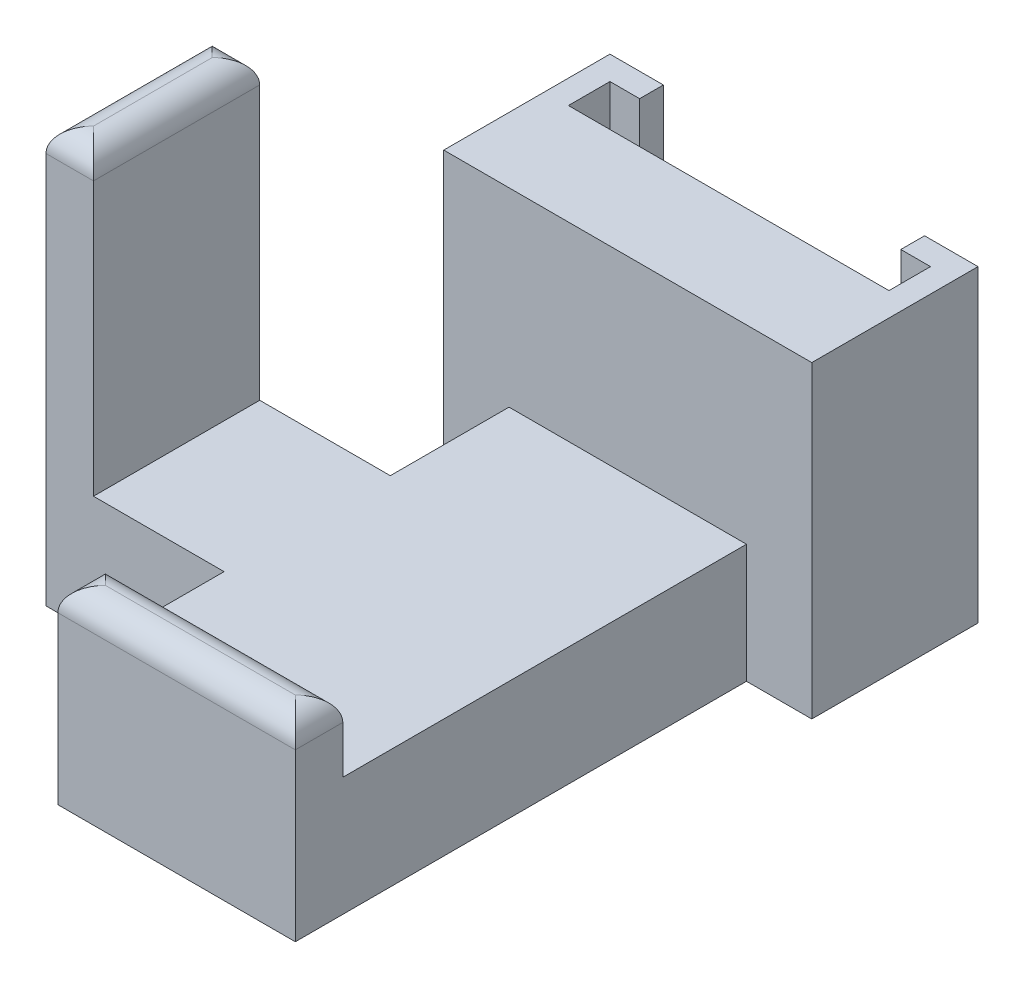
ISO-10303-21;
HEADER;
FILE_DESCRIPTION(('STEP AP214'),'2;1');
FILE_NAME('part.step','',(''),(''),'','','');
FILE_SCHEMA(('AUTOMOTIVE_DESIGN { 1 0 10303 214 1 1 1 1 }'));
ENDSEC;
DATA;
#1=APPLICATION_CONTEXT('core data for automotive mechanical design processes');
#2=APPLICATION_PROTOCOL_DEFINITION('international standard','automotive_design',2000,#1);
#3=PRODUCT_CONTEXT('',#1,'mechanical');
#4=PRODUCT('Part','Part','',(#3));
#5=PRODUCT_RELATED_PRODUCT_CATEGORY('part','',(#4));
#6=PRODUCT_DEFINITION_FORMATION('','',#4);
#7=PRODUCT_DEFINITION_CONTEXT('part definition',#1,'design');
#8=PRODUCT_DEFINITION('design','',#6,#7);
#9=PRODUCT_DEFINITION_SHAPE('','',#8);
#10=(LENGTH_UNIT() NAMED_UNIT(*) SI_UNIT(.MILLI.,.METRE.));
#11=(NAMED_UNIT(*) PLANE_ANGLE_UNIT() SI_UNIT($,.RADIAN.));
#12=(NAMED_UNIT(*) SI_UNIT($,.STERADIAN.) SOLID_ANGLE_UNIT());
#13=UNCERTAINTY_MEASURE_WITH_UNIT(LENGTH_MEASURE(1.E-05),#10,'distance_accuracy_value','');
#14=(GEOMETRIC_REPRESENTATION_CONTEXT(3) GLOBAL_UNCERTAINTY_ASSIGNED_CONTEXT((#13)) GLOBAL_UNIT_ASSIGNED_CONTEXT((#10,
#11,#12)) REPRESENTATION_CONTEXT('',''));
#15=CARTESIAN_POINT('',(0.,0.,0.));
#16=DIRECTION('',(0.,0.,1.));
#17=DIRECTION('',(1.,0.,0.));
#18=AXIS2_PLACEMENT_3D('',#15,#16,#17);
#19=CARTESIAN_POINT('',(0.,10.,0.));
#20=DIRECTION('',(0.,1.,0.));
#21=DIRECTION('',(0.,0.,1.));
#22=AXIS2_PLACEMENT_3D('',#19,#20,#21);
#23=PLANE('',#22);
#24=DIRECTION('',(0.,0.,-1.));
#25=VECTOR('',#24,1.);
#26=CARTESIAN_POINT('',(20.,10.,0.));
#27=LINE('',#26,#25);
#28=CARTESIAN_POINT('',(20.,10.,-3.99999999999999));
#29=VERTEX_POINT('',#28);
#30=CARTESIAN_POINT('',(20.,10.,-38.));
#31=VERTEX_POINT('',#30);
#32=EDGE_CURVE('E341',#29,#31,#27,.T.);
#33=ORIENTED_EDGE('',*,*,#32,.T.);
#34=DIRECTION('',(1.,0.,0.));
#35=VECTOR('',#34,1.);
#36=CARTESIAN_POINT('',(20.,10.,-38.));
#37=LINE('',#36,#35);
#38=CARTESIAN_POINT('',(0.,10.,-38.));
#39=VERTEX_POINT('',#38);
#40=EDGE_CURVE('E254',#39,#31,#37,.T.);
#41=ORIENTED_EDGE('',*,*,#40,.F.);
#42=DIRECTION('',(0.,0.,1.));
#43=VECTOR('',#42,1.);
#44=CARTESIAN_POINT('',(0.,10.,-28.));
#45=LINE('',#44,#43);
#46=CARTESIAN_POINT('',(0.,10.,-28.));
#47=VERTEX_POINT('',#46);
#48=EDGE_CURVE('E345',#39,#47,#45,.T.);
#49=ORIENTED_EDGE('',*,*,#48,.T.);
#50=DIRECTION('',(-1.,0.,0.));
#51=VECTOR('',#50,1.);
#52=CARTESIAN_POINT('',(0.,10.,-28.));
#53=LINE('',#52,#51);
#54=CARTESIAN_POINT('',(-11.,10.,-28.));
#55=VERTEX_POINT('',#54);
#56=EDGE_CURVE('E347',#47,#55,#53,.T.);
#57=ORIENTED_EDGE('',*,*,#56,.T.);
#58=DIRECTION('',(0.,0.,-1.));
#59=VECTOR('',#58,1.);
#60=CARTESIAN_POINT('',(-11.,10.,-28.));
#61=LINE('',#60,#59);
#62=CARTESIAN_POINT('',(-11.,10.,-14.));
#63=VERTEX_POINT('',#62);
#64=EDGE_CURVE('E330',#63,#55,#61,.T.);
#65=ORIENTED_EDGE('',*,*,#64,.F.);
#66=DIRECTION('',(1.,0.,0.));
#67=VECTOR('',#66,1.);
#68=CARTESIAN_POINT('',(0.,10.,-14.));
#69=LINE('',#68,#67);
#70=CARTESIAN_POINT('',(0.,10.,-14.));
#71=VERTEX_POINT('',#70);
#72=EDGE_CURVE('E350',#63,#71,#69,.T.);
#73=ORIENTED_EDGE('',*,*,#72,.T.);
#74=DIRECTION('',(0.,0.,1.));
#75=VECTOR('',#74,1.);
#76=CARTESIAN_POINT('',(0.,10.,0.));
#77=LINE('',#76,#75);
#78=CARTESIAN_POINT('',(0.,10.,-4.));
#79=VERTEX_POINT('',#78);
#80=EDGE_CURVE('E338',#71,#79,#77,.T.);
#81=ORIENTED_EDGE('',*,*,#80,.T.);
#82=DIRECTION('',(-1.,0.,0.));
#83=VECTOR('',#82,1.);
#84=CARTESIAN_POINT('',(0.,10.,-4.));
#85=LINE('',#84,#83);
#86=EDGE_CURVE('E322',#29,#79,#85,.T.);
#87=ORIENTED_EDGE('',*,*,#86,.F.);
#88=EDGE_LOOP('',(#33,#41,#49,#57,#65,#73,#81,#87));
#89=FACE_BOUND('',#88,.T.);
#90=ADVANCED_FACE('F36',(#89),#23,.T.);
#91=CARTESIAN_POINT('',(20.,10.,0.));
#92=DIRECTION('',(-1.,0.,0.));
#93=DIRECTION('',(0.,0.,1.));
#94=AXIS2_PLACEMENT_3D('',#91,#92,#93);
#95=PLANE('',#94);
#96=DIRECTION('',(0.,-1.,0.));
#97=VECTOR('',#96,1.);
#98=CARTESIAN_POINT('',(20.,10.,-38.));
#99=LINE('',#98,#97);
#100=CARTESIAN_POINT('',(20.,0.,-38.));
#101=VERTEX_POINT('',#100);
#102=EDGE_CURVE('E318',#31,#101,#99,.T.);
#103=ORIENTED_EDGE('',*,*,#102,.F.);
#104=ORIENTED_EDGE('',*,*,#32,.F.);
#105=DIRECTION('',(0.,-1.,0.));
#106=VECTOR('',#105,1.);
#107=CARTESIAN_POINT('',(20.,35.,-4.));
#108=LINE('',#107,#106);
#109=CARTESIAN_POINT('',(20.,14.,-4.));
#110=VERTEX_POINT('',#109);
#111=EDGE_CURVE('E328',#110,#29,#108,.T.);
#112=ORIENTED_EDGE('',*,*,#111,.F.);
#113=DIRECTION('',(0.,0.,1.));
#114=VECTOR('',#113,1.);
#115=CARTESIAN_POINT('',(20.,14.,0.));
#116=LINE('',#115,#114);
#117=CARTESIAN_POINT('',(20.,14.,0.));
#118=VERTEX_POINT('',#117);
#119=EDGE_CURVE('E391',#110,#118,#116,.T.);
#120=ORIENTED_EDGE('',*,*,#119,.T.);
#121=DIRECTION('',(0.,-1.,0.));
#122=VECTOR('',#121,1.);
#123=CARTESIAN_POINT('',(20.,10.,0.));
#124=LINE('',#123,#122);
#125=CARTESIAN_POINT('',(20.,0.,0.));
#126=VERTEX_POINT('',#125);
#127=EDGE_CURVE('E378',#118,#126,#124,.T.);
#128=ORIENTED_EDGE('',*,*,#127,.T.);
#129=DIRECTION('',(0.,0.,-1.));
#130=VECTOR('',#129,1.);
#131=CARTESIAN_POINT('',(20.,0.,0.));
#132=LINE('',#131,#130);
#133=EDGE_CURVE('E358',#126,#101,#132,.T.);
#134=ORIENTED_EDGE('',*,*,#133,.T.);
#135=EDGE_LOOP('',(#103,#104,#112,#120,#128,#134));
#136=FACE_BOUND('',#135,.T.);
#137=ADVANCED_FACE('F436',(#136),#95,.F.);
#138=CARTESIAN_POINT('',(0.,10.,-28.));
#139=DIRECTION('',(1.,0.,0.));
#140=DIRECTION('',(0.,0.,-1.));
#141=AXIS2_PLACEMENT_3D('',#138,#139,#140);
#142=PLANE('',#141);
#143=ORIENTED_EDGE('',*,*,#48,.F.);
#144=DIRECTION('',(0.,1.,0.));
#145=VECTOR('',#144,1.);
#146=CARTESIAN_POINT('',(0.,10.,-38.));
#147=LINE('',#146,#145);
#148=CARTESIAN_POINT('',(0.,0.,-38.));
#149=VERTEX_POINT('',#148);
#150=EDGE_CURVE('E314',#149,#39,#147,.T.);
#151=ORIENTED_EDGE('',*,*,#150,.F.);
#152=DIRECTION('',(0.,0.,1.));
#153=VECTOR('',#152,1.);
#154=CARTESIAN_POINT('',(0.,0.,-28.));
#155=LINE('',#154,#153);
#156=CARTESIAN_POINT('',(0.,0.,-28.));
#157=VERTEX_POINT('',#156);
#158=EDGE_CURVE('E360',#149,#157,#155,.T.);
#159=ORIENTED_EDGE('',*,*,#158,.T.);
#160=DIRECTION('',(0.,-1.,0.));
#161=VECTOR('',#160,1.);
#162=CARTESIAN_POINT('',(0.,10.,-28.));
#163=LINE('',#162,#161);
#164=EDGE_CURVE('E375',#47,#157,#163,.T.);
#165=ORIENTED_EDGE('',*,*,#164,.F.);
#166=EDGE_LOOP('',(#143,#151,#159,#165));
#167=FACE_BOUND('',#166,.T.);
#168=ADVANCED_FACE('F482',(#167),#142,.F.);
#169=CARTESIAN_POINT('',(0.,10.,0.));
#170=DIRECTION('',(1.,0.,0.));
#171=DIRECTION('',(0.,0.,-1.));
#172=AXIS2_PLACEMENT_3D('',#169,#170,#171);
#173=PLANE('',#172);
#174=DIRECTION('',(0.,-1.,0.));
#175=VECTOR('',#174,1.);
#176=CARTESIAN_POINT('',(0.,10.,0.));
#177=LINE('',#176,#175);
#178=CARTESIAN_POINT('',(0.,14.,0.));
#179=VERTEX_POINT('',#178);
#180=CARTESIAN_POINT('',(0.,0.,0.));
#181=VERTEX_POINT('',#180);
#182=EDGE_CURVE('E380',#179,#181,#177,.T.);
#183=ORIENTED_EDGE('',*,*,#182,.F.);
#184=DIRECTION('',(0.,0.,-1.));
#185=VECTOR('',#184,1.);
#186=CARTESIAN_POINT('',(0.,14.,-4.));
#187=LINE('',#186,#185);
#188=CARTESIAN_POINT('',(0.,14.,-4.));
#189=VERTEX_POINT('',#188);
#190=EDGE_CURVE('E45',#179,#189,#187,.T.);
#191=ORIENTED_EDGE('',*,*,#190,.T.);
#192=DIRECTION('',(0.,-1.,0.));
#193=VECTOR('',#192,1.);
#194=CARTESIAN_POINT('',(0.,35.,-4.));
#195=LINE('',#194,#193);
#196=EDGE_CURVE('E325',#189,#79,#195,.T.);
#197=ORIENTED_EDGE('',*,*,#196,.T.);
#198=ORIENTED_EDGE('',*,*,#80,.F.);
#199=DIRECTION('',(0.,-1.,0.));
#200=VECTOR('',#199,1.);
#201=CARTESIAN_POINT('',(0.,10.,-14.));
#202=LINE('',#201,#200);
#203=CARTESIAN_POINT('',(0.,0.,-14.));
#204=VERTEX_POINT('',#203);
#205=EDGE_CURVE('E352',#71,#204,#202,.T.);
#206=ORIENTED_EDGE('',*,*,#205,.T.);
#207=DIRECTION('',(0.,0.,1.));
#208=VECTOR('',#207,1.);
#209=CARTESIAN_POINT('',(0.,0.,0.));
#210=LINE('',#209,#208);
#211=EDGE_CURVE('E337',#204,#181,#210,.T.);
#212=ORIENTED_EDGE('',*,*,#211,.T.);
#213=EDGE_LOOP('',(#183,#191,#197,#198,#206,#212));
#214=FACE_BOUND('',#213,.T.);
#215=ADVANCED_FACE('F505',(#214),#173,.F.);
#216=CARTESIAN_POINT('',(0.,10.,0.));
#217=DIRECTION('',(0.,0.,-1.));
#218=DIRECTION('',(-1.,0.,0.));
#219=AXIS2_PLACEMENT_3D('',#216,#217,#218);
#220=PLANE('',#219);
#221=ORIENTED_EDGE('',*,*,#127,.F.);
#222=DIRECTION('',(-1.,0.,0.));
#223=VECTOR('',#222,1.);
#224=CARTESIAN_POINT('',(0.,14.,0.));
#225=LINE('',#224,#223);
#226=EDGE_CURVE('E394',#118,#179,#225,.T.);
#227=ORIENTED_EDGE('',*,*,#226,.T.);
#228=ORIENTED_EDGE('',*,*,#182,.T.);
#229=DIRECTION('',(1.,0.,0.));
#230=VECTOR('',#229,1.);
#231=CARTESIAN_POINT('',(0.,0.,0.));
#232=LINE('',#231,#230);
#233=EDGE_CURVE('E355',#181,#126,#232,.T.);
#234=ORIENTED_EDGE('',*,*,#233,.T.);
#235=EDGE_LOOP('',(#221,#227,#228,#234));
#236=FACE_BOUND('',#235,.T.);
#237=ADVANCED_FACE('F439',(#236),#220,.F.);
#238=CARTESIAN_POINT('',(0.,35.,-4.));
#239=DIRECTION('',(0.,0.,1.));
#240=DIRECTION('',(1.,0.,0.));
#241=AXIS2_PLACEMENT_3D('',#238,#239,#240);
#242=PLANE('',#241);
#243=ORIENTED_EDGE('',*,*,#196,.F.);
#244=DIRECTION('',(-1.,0.,0.));
#245=VECTOR('',#244,1.);
#246=CARTESIAN_POINT('',(20.,14.,-4.));
#247=LINE('',#246,#245);
#248=EDGE_CURVE('E13',#189,#110,#247,.F.);
#249=ORIENTED_EDGE('',*,*,#248,.T.);
#250=ORIENTED_EDGE('',*,*,#111,.T.);
#251=ORIENTED_EDGE('',*,*,#86,.T.);
#252=EDGE_LOOP('',(#243,#249,#250,#251));
#253=FACE_BOUND('',#252,.T.);
#254=ADVANCED_FACE('F502',(#253),#242,.F.);
#255=CARTESIAN_POINT('',(0.,10.,-28.));
#256=DIRECTION('',(0.,0.,1.));
#257=DIRECTION('',(1.,0.,0.));
#258=AXIS2_PLACEMENT_3D('',#255,#256,#257);
#259=PLANE('',#258);
#260=DIRECTION('',(0.,-1.,0.));
#261=VECTOR('',#260,1.);
#262=CARTESIAN_POINT('',(-15.,10.,-28.));
#263=LINE('',#262,#261);
#264=CARTESIAN_POINT('',(-15.,33.,-28.));
#265=VERTEX_POINT('',#264);
#266=CARTESIAN_POINT('',(-15.,0.,-28.));
#267=VERTEX_POINT('',#266);
#268=EDGE_CURVE('E373',#265,#267,#263,.T.);
#269=ORIENTED_EDGE('',*,*,#268,.F.);
#270=DIRECTION('',(-1.,0.,0.));
#271=VECTOR('',#270,1.);
#272=CARTESIAN_POINT('',(-11.,33.,-28.));
#273=LINE('',#272,#271);
#274=CARTESIAN_POINT('',(-11.,33.,-28.));
#275=VERTEX_POINT('',#274);
#276=EDGE_CURVE('E382',#265,#275,#273,.F.);
#277=ORIENTED_EDGE('',*,*,#276,.T.);
#278=DIRECTION('',(0.,-1.,0.));
#279=VECTOR('',#278,1.);
#280=CARTESIAN_POINT('',(-11.,35.,-28.));
#281=LINE('',#280,#279);
#282=EDGE_CURVE('E333',#275,#55,#281,.T.);
#283=ORIENTED_EDGE('',*,*,#282,.T.);
#284=ORIENTED_EDGE('',*,*,#56,.F.);
#285=ORIENTED_EDGE('',*,*,#164,.T.);
#286=DIRECTION('',(-1.,0.,0.));
#287=VECTOR('',#286,1.);
#288=CARTESIAN_POINT('',(0.,0.,-28.));
#289=LINE('',#288,#287);
#290=EDGE_CURVE('E362',#157,#267,#289,.T.);
#291=ORIENTED_EDGE('',*,*,#290,.T.);
#292=EDGE_LOOP('',(#269,#277,#283,#284,#285,#291));
#293=FACE_BOUND('',#292,.T.);
#294=ADVANCED_FACE('F498',(#293),#259,.F.);
#295=CARTESIAN_POINT('',(-15.,10.,-14.));
#296=DIRECTION('',(1.,0.,0.));
#297=DIRECTION('',(0.,0.,-1.));
#298=AXIS2_PLACEMENT_3D('',#295,#296,#297);
#299=PLANE('',#298);
#300=DIRECTION('',(0.,-1.,0.));
#301=VECTOR('',#300,1.);
#302=CARTESIAN_POINT('',(-15.,10.,-14.));
#303=LINE('',#302,#301);
#304=CARTESIAN_POINT('',(-15.,33.,-14.));
#305=VERTEX_POINT('',#304);
#306=CARTESIAN_POINT('',(-15.,0.,-14.));
#307=VERTEX_POINT('',#306);
#308=EDGE_CURVE('E371',#305,#307,#303,.T.);
#309=ORIENTED_EDGE('',*,*,#308,.F.);
#310=DIRECTION('',(0.,0.,1.));
#311=VECTOR('',#310,1.);
#312=CARTESIAN_POINT('',(-15.,33.,-28.));
#313=LINE('',#312,#311);
#314=EDGE_CURVE('E389',#305,#265,#313,.F.);
#315=ORIENTED_EDGE('',*,*,#314,.T.);
#316=ORIENTED_EDGE('',*,*,#268,.T.);
#317=DIRECTION('',(0.,0.,1.));
#318=VECTOR('',#317,1.);
#319=CARTESIAN_POINT('',(-15.,0.,-14.));
#320=LINE('',#319,#318);
#321=EDGE_CURVE('E365',#267,#307,#320,.T.);
#322=ORIENTED_EDGE('',*,*,#321,.T.);
#323=EDGE_LOOP('',(#309,#315,#316,#322));
#324=FACE_BOUND('',#323,.T.);
#325=ADVANCED_FACE('F494',(#324),#299,.F.);
#326=CARTESIAN_POINT('',(0.,10.,-14.));
#327=DIRECTION('',(0.,0.,-1.));
#328=DIRECTION('',(-1.,0.,0.));
#329=AXIS2_PLACEMENT_3D('',#326,#327,#328);
#330=PLANE('',#329);
#331=DIRECTION('',(0.,-1.,0.));
#332=VECTOR('',#331,1.);
#333=CARTESIAN_POINT('',(-11.,35.,-14.));
#334=LINE('',#333,#332);
#335=CARTESIAN_POINT('',(-11.,33.,-14.));
#336=VERTEX_POINT('',#335);
#337=EDGE_CURVE('E335',#336,#63,#334,.T.);
#338=ORIENTED_EDGE('',*,*,#337,.F.);
#339=DIRECTION('',(1.,0.,0.));
#340=VECTOR('',#339,1.);
#341=CARTESIAN_POINT('',(-15.,33.,-14.));
#342=LINE('',#341,#340);
#343=EDGE_CURVE('E387',#336,#305,#342,.F.);
#344=ORIENTED_EDGE('',*,*,#343,.T.);
#345=ORIENTED_EDGE('',*,*,#308,.T.);
#346=DIRECTION('',(1.,0.,0.));
#347=VECTOR('',#346,1.);
#348=CARTESIAN_POINT('',(0.,0.,-14.));
#349=LINE('',#348,#347);
#350=EDGE_CURVE('E342',#307,#204,#349,.T.);
#351=ORIENTED_EDGE('',*,*,#350,.T.);
#352=ORIENTED_EDGE('',*,*,#205,.F.);
#353=ORIENTED_EDGE('',*,*,#72,.F.);
#354=EDGE_LOOP('',(#338,#344,#345,#351,#352,#353));
#355=FACE_BOUND('',#354,.T.);
#356=ADVANCED_FACE('F490',(#355),#330,.F.);
#357=CARTESIAN_POINT('',(0.,0.,0.));
#358=DIRECTION('',(0.,1.,0.));
#359=DIRECTION('',(0.,0.,1.));
#360=AXIS2_PLACEMENT_3D('',#357,#358,#359);
#361=PLANE('',#360);
#362=CARTESIAN_POINT('',(-7.5,0.,-21.));
#363=DIRECTION('',(0.,-1.,0.));
#364=DIRECTION('',(0.,0.,-1.));
#365=AXIS2_PLACEMENT_3D('',#362,#363,#364);
#366=CIRCLE('',#365,2.);
#367=CARTESIAN_POINT('',(-7.5,0.,-23.));
#368=VERTEX_POINT('',#367);
#369=EDGE_CURVE('E280',#368,#368,#366,.T.);
#370=ORIENTED_EDGE('',*,*,#369,.F.);
#371=EDGE_LOOP('',(#370));
#372=FACE_BOUND('',#371,.T.);
#373=CARTESIAN_POINT('',(7.5,0.,-6.));
#374=DIRECTION('',(0.,-1.,0.));
#375=DIRECTION('',(0.,0.,-1.));
#376=AXIS2_PLACEMENT_3D('',#373,#374,#375);
#377=CIRCLE('',#376,2.);
#378=CARTESIAN_POINT('',(7.5,0.,-8.));
#379=VERTEX_POINT('',#378);
#380=EDGE_CURVE('E286',#379,#379,#377,.T.);
#381=ORIENTED_EDGE('',*,*,#380,.F.);
#382=EDGE_LOOP('',(#381));
#383=FACE_BOUND('',#382,.T.);
#384=DIRECTION('',(-1.,0.,0.));
#385=VECTOR('',#384,1.);
#386=CARTESIAN_POINT('',(25.5,0.,-38.));
#387=LINE('',#386,#385);
#388=CARTESIAN_POINT('',(25.5,0.,-38.));
#389=VERTEX_POINT('',#388);
#390=EDGE_CURVE('E308',#389,#101,#387,.T.);
#391=ORIENTED_EDGE('',*,*,#390,.T.);
#392=ORIENTED_EDGE('',*,*,#133,.F.);
#393=ORIENTED_EDGE('',*,*,#233,.F.);
#394=ORIENTED_EDGE('',*,*,#211,.F.);
#395=ORIENTED_EDGE('',*,*,#350,.F.);
#396=ORIENTED_EDGE('',*,*,#321,.F.);
#397=ORIENTED_EDGE('',*,*,#290,.F.);
#398=ORIENTED_EDGE('',*,*,#158,.F.);
#399=CARTESIAN_POINT('',(-5.5,0.,-38.));
#400=VERTEX_POINT('',#399);
#401=EDGE_CURVE('E307',#149,#400,#387,.T.);
#402=ORIENTED_EDGE('',*,*,#401,.T.);
#403=DIRECTION('',(0.,0.,-1.));
#404=VECTOR('',#403,1.);
#405=CARTESIAN_POINT('',(-5.5,0.,-38.));
#406=LINE('',#405,#404);
#407=CARTESIAN_POINT('',(-5.5,0.,-52.));
#408=VERTEX_POINT('',#407);
#409=EDGE_CURVE('E312',#400,#408,#406,.T.);
#410=ORIENTED_EDGE('',*,*,#409,.T.);
#411=DIRECTION('',(-1.,0.,0.));
#412=VECTOR('',#411,1.);
#413=CARTESIAN_POINT('',(25.5,0.,-52.));
#414=LINE('',#413,#412);
#415=CARTESIAN_POINT('',(25.5,0.,-52.));
#416=VERTEX_POINT('',#415);
#417=EDGE_CURVE('E298',#416,#408,#414,.T.);
#418=ORIENTED_EDGE('',*,*,#417,.F.);
#419=DIRECTION('',(0.,0.,-1.));
#420=VECTOR('',#419,1.);
#421=CARTESIAN_POINT('',(25.5,0.,-38.));
#422=LINE('',#421,#420);
#423=EDGE_CURVE('E311',#389,#416,#422,.T.);
#424=ORIENTED_EDGE('',*,*,#423,.F.);
#425=EDGE_LOOP('',(#391,#392,#393,#394,#395,#396,#397,#398,#402,#410,#418,#424));
#426=FACE_BOUND('',#425,.T.);
#427=ADVANCED_FACE('F445',(#372,#383,#426),#361,.F.);
#428=CARTESIAN_POINT('',(-11.,35.,-28.));
#429=DIRECTION('',(-1.,0.,0.));
#430=DIRECTION('',(0.,0.,1.));
#431=AXIS2_PLACEMENT_3D('',#428,#429,#430);
#432=PLANE('',#431);
#433=ORIENTED_EDGE('',*,*,#282,.F.);
#434=DIRECTION('',(0.,0.,-1.));
#435=VECTOR('',#434,1.);
#436=CARTESIAN_POINT('',(-11.,33.,-14.));
#437=LINE('',#436,#435);
#438=EDGE_CURVE('E385',#275,#336,#437,.F.);
#439=ORIENTED_EDGE('',*,*,#438,.T.);
#440=ORIENTED_EDGE('',*,*,#337,.T.);
#441=ORIENTED_EDGE('',*,*,#64,.T.);
#442=EDGE_LOOP('',(#433,#439,#440,#441));
#443=FACE_BOUND('',#442,.T.);
#444=ADVANCED_FACE('F486',(#443),#432,.F.);
#445=CARTESIAN_POINT('',(0.,33.,-16.));
#446=DIRECTION('',(-1.,0.,0.));
#447=DIRECTION('',(0.,0.,1.));
#448=AXIS2_PLACEMENT_3D('',#445,#446,#447);
#449=CYLINDRICAL_SURFACE('',#448,2.);
#450=CARTESIAN_POINT('',(-13.,33.,-16.));
#451=DIRECTION('',(-0.707106781186548,0.,-0.707106781186547));
#452=DIRECTION('',(0.707106781186547,0.,-0.707106781186548));
#453=AXIS2_PLACEMENT_3D('',#450,#451,#452);
#454=ELLIPSE('',#453,2.82842712474619,2.);
#455=CARTESIAN_POINT('',(-13.,35.,-16.));
#456=VERTEX_POINT('',#455);
#457=EDGE_CURVE('E402',#305,#456,#454,.T.);
#458=ORIENTED_EDGE('',*,*,#457,.F.);
#459=ORIENTED_EDGE('',*,*,#343,.F.);
#460=CARTESIAN_POINT('',(-13.,33.,-16.));
#461=DIRECTION('',(-0.707106781186547,0.,0.707106781186548));
#462=DIRECTION('',(-0.707106781186548,0.,-0.707106781186547));
#463=AXIS2_PLACEMENT_3D('',#460,#461,#462);
#464=ELLIPSE('',#463,2.82842712474619,2.);
#465=EDGE_CURVE('E326',#456,#336,#464,.F.);
#466=ORIENTED_EDGE('',*,*,#465,.F.);
#467=EDGE_LOOP('',(#458,#459,#466));
#468=FACE_BOUND('',#467,.T.);
#469=ADVANCED_FACE('F524',(#468),#449,.T.);
#470=CARTESIAN_POINT('',(-13.,33.,0.));
#471=DIRECTION('',(0.,0.,1.));
#472=DIRECTION('',(1.,0.,0.));
#473=AXIS2_PLACEMENT_3D('',#470,#471,#472);
#474=CYLINDRICAL_SURFACE('',#473,2.);
#475=DIRECTION('',(0.,0.,-1.));
#476=VECTOR('',#475,1.);
#477=CARTESIAN_POINT('',(-13.,35.,-28.));
#478=LINE('',#477,#476);
#479=CARTESIAN_POINT('',(-13.,35.,-26.));
#480=VERTEX_POINT('',#479);
#481=EDGE_CURVE('E405',#456,#480,#478,.T.);
#482=ORIENTED_EDGE('',*,*,#481,.F.);
#483=ORIENTED_EDGE('',*,*,#465,.T.);
#484=ORIENTED_EDGE('',*,*,#438,.F.);
#485=CARTESIAN_POINT('',(-13.,33.,-26.));
#486=DIRECTION('',(0.707106781186547,0.,0.707106781186548));
#487=DIRECTION('',(-0.707106781186548,0.,0.707106781186547));
#488=AXIS2_PLACEMENT_3D('',#485,#486,#487);
#489=ELLIPSE('',#488,2.82842712474619,2.);
#490=EDGE_CURVE('E400',#480,#275,#489,.F.);
#491=ORIENTED_EDGE('',*,*,#490,.F.);
#492=EDGE_LOOP('',(#482,#483,#484,#491));
#493=FACE_BOUND('',#492,.T.);
#494=ADVANCED_FACE('F520',(#493),#474,.T.);
#495=CARTESIAN_POINT('',(-13.,33.,0.));
#496=DIRECTION('',(0.,0.,-1.));
#497=DIRECTION('',(-1.,0.,0.));
#498=AXIS2_PLACEMENT_3D('',#495,#496,#497);
#499=CYLINDRICAL_SURFACE('',#498,2.);
#500=ORIENTED_EDGE('',*,*,#457,.T.);
#501=ORIENTED_EDGE('',*,*,#481,.T.);
#502=CARTESIAN_POINT('',(-13.,33.,-26.));
#503=DIRECTION('',(0.707106781186548,0.,-0.707106781186547));
#504=DIRECTION('',(-0.707106781186547,0.,-0.707106781186548));
#505=AXIS2_PLACEMENT_3D('',#502,#503,#504);
#506=ELLIPSE('',#505,2.82842712474619,2.);
#507=EDGE_CURVE('E397',#265,#480,#506,.T.);
#508=ORIENTED_EDGE('',*,*,#507,.F.);
#509=ORIENTED_EDGE('',*,*,#314,.F.);
#510=EDGE_LOOP('',(#500,#501,#508,#509));
#511=FACE_BOUND('',#510,.T.);
#512=ADVANCED_FACE('F516',(#511),#499,.T.);
#513=CARTESIAN_POINT('',(0.,33.,-26.));
#514=DIRECTION('',(1.,0.,0.));
#515=DIRECTION('',(0.,0.,-1.));
#516=AXIS2_PLACEMENT_3D('',#513,#514,#515);
#517=CYLINDRICAL_SURFACE('',#516,2.);
#518=ORIENTED_EDGE('',*,*,#490,.T.);
#519=ORIENTED_EDGE('',*,*,#276,.F.);
#520=ORIENTED_EDGE('',*,*,#507,.T.);
#521=EDGE_LOOP('',(#518,#519,#520));
#522=FACE_BOUND('',#521,.T.);
#523=ADVANCED_FACE('F513',(#522),#517,.T.);
#524=CARTESIAN_POINT('',(2.,14.,0.));
#525=DIRECTION('',(0.,0.,1.));
#526=DIRECTION('',(1.,0.,0.));
#527=AXIS2_PLACEMENT_3D('',#524,#525,#526);
#528=CYLINDRICAL_SURFACE('',#527,2.);
#529=CARTESIAN_POINT('',(2.,14.,-2.));
#530=DIRECTION('',(0.707106781186547,0.,-0.707106781186547));
#531=DIRECTION('',(0.707106781186547,0.,0.707106781186547));
#532=AXIS2_PLACEMENT_3D('',#529,#530,#531);
#533=ELLIPSE('',#532,2.82842712474619,2.);
#534=CARTESIAN_POINT('',(2.,16.,-2.));
#535=VERTEX_POINT('',#534);
#536=EDGE_CURVE('E40',#189,#535,#533,.T.);
#537=ORIENTED_EDGE('',*,*,#536,.F.);
#538=ORIENTED_EDGE('',*,*,#190,.F.);
#539=CARTESIAN_POINT('',(2.,14.,-2.));
#540=DIRECTION('',(0.707106781186547,0.,0.707106781186547));
#541=DIRECTION('',(-0.707106781186547,0.,0.707106781186547));
#542=AXIS2_PLACEMENT_3D('',#539,#540,#541);
#543=ELLIPSE('',#542,2.82842712474619,2.);
#544=EDGE_CURVE('E415',#535,#179,#543,.T.);
#545=ORIENTED_EDGE('',*,*,#544,.F.);
#546=EDGE_LOOP('',(#537,#538,#545));
#547=FACE_BOUND('',#546,.T.);
#548=ADVANCED_FACE('F38',(#547),#528,.T.);
#549=CARTESIAN_POINT('',(0.,14.,-2.));
#550=DIRECTION('',(1.,0.,0.));
#551=DIRECTION('',(0.,0.,-1.));
#552=AXIS2_PLACEMENT_3D('',#549,#550,#551);
#553=CYLINDRICAL_SURFACE('',#552,2.);
#554=ORIENTED_EDGE('',*,*,#248,.F.);
#555=ORIENTED_EDGE('',*,*,#536,.T.);
#556=DIRECTION('',(-1.,0.,0.));
#557=VECTOR('',#556,1.);
#558=CARTESIAN_POINT('',(0.,16.,-2.));
#559=LINE('',#558,#557);
#560=CARTESIAN_POINT('',(18.,16.,-2.));
#561=VERTEX_POINT('',#560);
#562=EDGE_CURVE('E413',#561,#535,#559,.T.);
#563=ORIENTED_EDGE('',*,*,#562,.F.);
#564=CARTESIAN_POINT('',(18.,14.,-2.));
#565=DIRECTION('',(0.707106781186547,0.,0.707106781186547));
#566=DIRECTION('',(0.707106781186547,0.,-0.707106781186547));
#567=AXIS2_PLACEMENT_3D('',#564,#565,#566);
#568=ELLIPSE('',#567,2.82842712474619,2.);
#569=EDGE_CURVE('E410',#110,#561,#568,.T.);
#570=ORIENTED_EDGE('',*,*,#569,.F.);
#571=EDGE_LOOP('',(#554,#555,#563,#570));
#572=FACE_BOUND('',#571,.T.);
#573=ADVANCED_FACE('F423',(#572),#553,.T.);
#574=CARTESIAN_POINT('',(0.,14.,-2.));
#575=DIRECTION('',(1.,0.,0.));
#576=DIRECTION('',(0.,0.,-1.));
#577=AXIS2_PLACEMENT_3D('',#574,#575,#576);
#578=CYLINDRICAL_SURFACE('',#577,2.);
#579=ORIENTED_EDGE('',*,*,#544,.T.);
#580=ORIENTED_EDGE('',*,*,#226,.F.);
#581=CARTESIAN_POINT('',(18.,14.,-2.));
#582=DIRECTION('',(0.707106781186547,0.,-0.707106781186547));
#583=DIRECTION('',(0.707106781186547,0.,0.707106781186547));
#584=AXIS2_PLACEMENT_3D('',#581,#582,#583);
#585=ELLIPSE('',#584,2.82842712474619,2.);
#586=EDGE_CURVE('E321',#561,#118,#585,.T.);
#587=ORIENTED_EDGE('',*,*,#586,.F.);
#588=ORIENTED_EDGE('',*,*,#562,.T.);
#589=EDGE_LOOP('',(#579,#580,#587,#588));
#590=FACE_BOUND('',#589,.T.);
#591=ADVANCED_FACE('F428',(#590),#578,.T.);
#592=CARTESIAN_POINT('',(18.,14.,0.));
#593=DIRECTION('',(0.,0.,-1.));
#594=DIRECTION('',(-1.,0.,0.));
#595=AXIS2_PLACEMENT_3D('',#592,#593,#594);
#596=CYLINDRICAL_SURFACE('',#595,2.);
#597=ORIENTED_EDGE('',*,*,#119,.F.);
#598=ORIENTED_EDGE('',*,*,#569,.T.);
#599=ORIENTED_EDGE('',*,*,#586,.T.);
#600=EDGE_LOOP('',(#597,#598,#599));
#601=FACE_BOUND('',#600,.T.);
#602=ADVANCED_FACE('F431',(#601),#596,.T.);
#603=CARTESIAN_POINT('',(0.,0.,-38.));
#604=DIRECTION('',(0.,0.,-1.));
#605=DIRECTION('',(-1.,0.,0.));
#606=AXIS2_PLACEMENT_3D('',#603,#604,#605);
#607=PLANE('',#606);
#608=DIRECTION('',(0.,-1.,0.));
#609=VECTOR('',#608,1.);
#610=CARTESIAN_POINT('',(25.5,0.,-38.));
#611=LINE('',#610,#609);
#612=CARTESIAN_POINT('',(25.5,26.,-38.));
#613=VERTEX_POINT('',#612);
#614=EDGE_CURVE('E304',#613,#389,#611,.T.);
#615=ORIENTED_EDGE('',*,*,#614,.F.);
#616=DIRECTION('',(1.,0.,0.));
#617=VECTOR('',#616,1.);
#618=CARTESIAN_POINT('',(20.,26.,-38.));
#619=LINE('',#618,#617);
#620=CARTESIAN_POINT('',(-5.49999999999999,26.,-38.));
#621=VERTEX_POINT('',#620);
#622=EDGE_CURVE('E270',#621,#613,#619,.T.);
#623=ORIENTED_EDGE('',*,*,#622,.F.);
#624=DIRECTION('',(0.,1.,0.));
#625=VECTOR('',#624,1.);
#626=CARTESIAN_POINT('',(-5.5,4.00000000000001,-38.));
#627=LINE('',#626,#625);
#628=EDGE_CURVE('E301',#400,#621,#627,.T.);
#629=ORIENTED_EDGE('',*,*,#628,.F.);
#630=ORIENTED_EDGE('',*,*,#401,.F.);
#631=ORIENTED_EDGE('',*,*,#150,.T.);
#632=ORIENTED_EDGE('',*,*,#40,.T.);
#633=ORIENTED_EDGE('',*,*,#102,.T.);
#634=ORIENTED_EDGE('',*,*,#390,.F.);
#635=EDGE_LOOP('',(#615,#623,#629,#630,#631,#632,#633,#634));
#636=FACE_BOUND('',#635,.T.);
#637=ADVANCED_FACE('F448',(#636),#607,.F.);
#638=CARTESIAN_POINT('',(-5.5,4.00000000000001,-38.));
#639=DIRECTION('',(-1.,0.,0.));
#640=DIRECTION('',(0.,-1.,0.));
#641=AXIS2_PLACEMENT_3D('',#638,#639,#640);
#642=PLANE('',#641);
#643=ORIENTED_EDGE('',*,*,#628,.T.);
#644=DIRECTION('',(0.,0.,1.));
#645=VECTOR('',#644,1.);
#646=CARTESIAN_POINT('',(-5.49999999999999,26.,-52.));
#647=LINE('',#646,#645);
#648=CARTESIAN_POINT('',(-5.49999999999999,26.,-52.));
#649=VERTEX_POINT('',#648);
#650=EDGE_CURVE('E277',#649,#621,#647,.T.);
#651=ORIENTED_EDGE('',*,*,#650,.F.);
#652=DIRECTION('',(0.,1.,0.));
#653=VECTOR('',#652,1.);
#654=CARTESIAN_POINT('',(-5.5,4.00000000000001,-52.));
#655=LINE('',#654,#653);
#656=EDGE_CURVE('E292',#408,#649,#655,.T.);
#657=ORIENTED_EDGE('',*,*,#656,.F.);
#658=ORIENTED_EDGE('',*,*,#409,.F.);
#659=EDGE_LOOP('',(#643,#651,#657,#658));
#660=FACE_BOUND('',#659,.T.);
#661=ADVANCED_FACE('F651',(#660),#642,.T.);
#662=CARTESIAN_POINT('',(25.5,0.,-38.));
#663=DIRECTION('',(1.,0.,0.));
#664=DIRECTION('',(0.,0.,-1.));
#665=AXIS2_PLACEMENT_3D('',#662,#663,#664);
#666=PLANE('',#665);
#667=ORIENTED_EDGE('',*,*,#423,.T.);
#668=DIRECTION('',(0.,-1.,0.));
#669=VECTOR('',#668,1.);
#670=CARTESIAN_POINT('',(25.5,0.,-52.));
#671=LINE('',#670,#669);
#672=CARTESIAN_POINT('',(25.5,26.,-52.));
#673=VERTEX_POINT('',#672);
#674=EDGE_CURVE('E295',#673,#416,#671,.T.);
#675=ORIENTED_EDGE('',*,*,#674,.F.);
#676=DIRECTION('',(0.,0.,-1.));
#677=VECTOR('',#676,1.);
#678=CARTESIAN_POINT('',(25.5,26.,-38.));
#679=LINE('',#678,#677);
#680=EDGE_CURVE('E273',#613,#673,#679,.T.);
#681=ORIENTED_EDGE('',*,*,#680,.F.);
#682=ORIENTED_EDGE('',*,*,#614,.T.);
#683=EDGE_LOOP('',(#667,#675,#681,#682));
#684=FACE_BOUND('',#683,.T.);
#685=ADVANCED_FACE('F645',(#684),#666,.T.);
#686=CARTESIAN_POINT('',(0.,0.,-52.));
#687=DIRECTION('',(0.,0.,-1.));
#688=DIRECTION('',(-1.,0.,0.));
#689=AXIS2_PLACEMENT_3D('',#686,#687,#688);
#690=PLANE('',#689);
#691=DIRECTION('',(0.,-1.,0.));
#692=VECTOR('',#691,1.);
#693=CARTESIAN_POINT('',(21.,26.,-52.));
#694=LINE('',#693,#692);
#695=CARTESIAN_POINT('',(21.,26.,-52.));
#696=VERTEX_POINT('',#695);
#697=CARTESIAN_POINT('',(21.,14.,-52.));
#698=VERTEX_POINT('',#697);
#699=EDGE_CURVE('E764',#696,#698,#694,.T.);
#700=ORIENTED_EDGE('',*,*,#699,.F.);
#701=DIRECTION('',(-1.,0.,0.));
#702=VECTOR('',#701,1.);
#703=CARTESIAN_POINT('',(25.5,26.,-52.));
#704=LINE('',#703,#702);
#705=EDGE_CURVE('E235',#673,#696,#704,.T.);
#706=ORIENTED_EDGE('',*,*,#705,.F.);
#707=ORIENTED_EDGE('',*,*,#674,.T.);
#708=ORIENTED_EDGE('',*,*,#417,.T.);
#709=ORIENTED_EDGE('',*,*,#656,.T.);
#710=CARTESIAN_POINT('',(-1.,26.,-52.));
#711=VERTEX_POINT('',#710);
#712=EDGE_CURVE('E275',#711,#649,#704,.T.);
#713=ORIENTED_EDGE('',*,*,#712,.F.);
#714=DIRECTION('',(0.,1.,0.));
#715=VECTOR('',#714,1.);
#716=CARTESIAN_POINT('',(-1.,14.,-52.));
#717=LINE('',#716,#715);
#718=CARTESIAN_POINT('',(-1.,14.,-52.));
#719=VERTEX_POINT('',#718);
#720=EDGE_CURVE('E760',#719,#711,#717,.T.);
#721=ORIENTED_EDGE('',*,*,#720,.F.);
#722=DIRECTION('',(-1.,0.,0.));
#723=VECTOR('',#722,1.);
#724=CARTESIAN_POINT('',(21.,14.,-52.));
#725=LINE('',#724,#723);
#726=EDGE_CURVE('E236',#698,#719,#725,.T.);
#727=ORIENTED_EDGE('',*,*,#726,.F.);
#728=EDGE_LOOP('',(#700,#706,#707,#708,#709,#713,#721,#727));
#729=FACE_BOUND('',#728,.T.);
#730=ADVANCED_FACE('F650',(#729),#690,.T.);
#731=CARTESIAN_POINT('',(7.5,4.,-6.));
#732=DIRECTION('',(0.,-1.,0.));
#733=DIRECTION('',(0.,0.,-1.));
#734=AXIS2_PLACEMENT_3D('',#731,#732,#733);
#735=CONICAL_SURFACE('',#734,2.,1.02974425867665);
#736=CARTESIAN_POINT('',(7.5,5.20172123805512,-6.));
#737=VERTEX_POINT('',#736);
#738=VERTEX_LOOP('',#737);
#739=FACE_BOUND('',#738,.T.);
#740=CARTESIAN_POINT('',(7.5,4.,-6.));
#741=DIRECTION('',(0.,-1.,0.));
#742=DIRECTION('',(0.,0.,-1.));
#743=AXIS2_PLACEMENT_3D('',#740,#741,#742);
#744=CIRCLE('',#743,2.);
#745=CARTESIAN_POINT('',(7.5,4.,-8.));
#746=VERTEX_POINT('',#745);
#747=EDGE_CURVE('E289',#746,#746,#744,.T.);
#748=ORIENTED_EDGE('',*,*,#747,.T.);
#749=EDGE_LOOP('',(#748));
#750=FACE_BOUND('',#749,.T.);
#751=ADVANCED_FACE('F694',(#739,#750),#735,.F.);
#752=CARTESIAN_POINT('',(7.5,0.,-6.));
#753=DIRECTION('',(0.,-1.,0.));
#754=DIRECTION('',(0.,0.,-1.));
#755=AXIS2_PLACEMENT_3D('',#752,#753,#754);
#756=CYLINDRICAL_SURFACE('',#755,2.);
#757=ORIENTED_EDGE('',*,*,#747,.F.);
#758=EDGE_LOOP('',(#757));
#759=FACE_BOUND('',#758,.T.);
#760=ORIENTED_EDGE('',*,*,#380,.T.);
#761=EDGE_LOOP('',(#760));
#762=FACE_BOUND('',#761,.T.);
#763=ADVANCED_FACE('F685',(#759,#762),#756,.F.);
#764=CARTESIAN_POINT('',(-7.5,4.,-21.));
#765=DIRECTION('',(0.,-1.,0.));
#766=DIRECTION('',(0.,0.,-1.));
#767=AXIS2_PLACEMENT_3D('',#764,#765,#766);
#768=CONICAL_SURFACE('',#767,2.,1.02974425867665);
#769=CARTESIAN_POINT('',(-7.5,5.20172123805512,-21.));
#770=VERTEX_POINT('',#769);
#771=VERTEX_LOOP('',#770);
#772=FACE_BOUND('',#771,.T.);
#773=CARTESIAN_POINT('',(-7.5,4.,-21.));
#774=DIRECTION('',(0.,-1.,0.));
#775=DIRECTION('',(0.,0.,-1.));
#776=AXIS2_PLACEMENT_3D('',#773,#774,#775);
#777=CIRCLE('',#776,2.);
#778=CARTESIAN_POINT('',(-7.5,4.,-23.));
#779=VERTEX_POINT('',#778);
#780=EDGE_CURVE('E283',#779,#779,#777,.T.);
#781=ORIENTED_EDGE('',*,*,#780,.T.);
#782=EDGE_LOOP('',(#781));
#783=FACE_BOUND('',#782,.T.);
#784=ADVANCED_FACE('F675',(#772,#783),#768,.F.);
#785=CARTESIAN_POINT('',(-7.5,0.,-21.));
#786=DIRECTION('',(0.,-1.,0.));
#787=DIRECTION('',(0.,0.,-1.));
#788=AXIS2_PLACEMENT_3D('',#785,#786,#787);
#789=CYLINDRICAL_SURFACE('',#788,2.);
#790=ORIENTED_EDGE('',*,*,#780,.F.);
#791=EDGE_LOOP('',(#790));
#792=FACE_BOUND('',#791,.T.);
#793=ORIENTED_EDGE('',*,*,#369,.T.);
#794=EDGE_LOOP('',(#793));
#795=FACE_BOUND('',#794,.T.);
#796=ADVANCED_FACE('F475',(#792,#795),#789,.F.);
#797=CARTESIAN_POINT('',(0.,26.,0.));
#798=DIRECTION('',(0.,-1.,0.));
#799=DIRECTION('',(1.,0.,0.));
#800=AXIS2_PLACEMENT_3D('',#797,#798,#799);
#801=PLANE('',#800);
#802=ORIENTED_EDGE('',*,*,#705,.T.);
#803=DIRECTION('',(0.,0.,-1.));
#804=VECTOR('',#803,1.);
#805=CARTESIAN_POINT('',(21.,26.,-24.9400718277167));
#806=LINE('',#805,#804);
#807=CARTESIAN_POINT('',(21.,26.,-50.));
#808=VERTEX_POINT('',#807);
#809=EDGE_CURVE('E220',#808,#696,#806,.T.);
#810=ORIENTED_EDGE('',*,*,#809,.F.);
#811=DIRECTION('',(-1.,0.,0.));
#812=VECTOR('',#811,1.);
#813=CARTESIAN_POINT('',(-3.49999999999999,26.,-50.));
#814=LINE('',#813,#812);
#815=CARTESIAN_POINT('',(23.5,26.,-50.));
#816=VERTEX_POINT('',#815);
#817=EDGE_CURVE('E232',#816,#808,#814,.T.);
#818=ORIENTED_EDGE('',*,*,#817,.F.);
#819=DIRECTION('',(0.,0.,-1.));
#820=VECTOR('',#819,1.);
#821=CARTESIAN_POINT('',(23.5,26.,-50.));
#822=LINE('',#821,#820);
#823=CARTESIAN_POINT('',(23.5,26.,-46.5));
#824=VERTEX_POINT('',#823);
#825=EDGE_CURVE('E248',#824,#816,#822,.T.);
#826=ORIENTED_EDGE('',*,*,#825,.F.);
#827=DIRECTION('',(1.,0.,0.));
#828=VECTOR('',#827,1.);
#829=CARTESIAN_POINT('',(-3.49999999999999,26.,-46.5));
#830=LINE('',#829,#828);
#831=CARTESIAN_POINT('',(-3.49999999999999,26.,-46.5));
#832=VERTEX_POINT('',#831);
#833=EDGE_CURVE('E260',#832,#824,#830,.T.);
#834=ORIENTED_EDGE('',*,*,#833,.F.);
#835=DIRECTION('',(0.,0.,1.));
#836=VECTOR('',#835,1.);
#837=CARTESIAN_POINT('',(-3.49999999999999,26.,-46.5));
#838=LINE('',#837,#836);
#839=CARTESIAN_POINT('',(-3.49999999999999,26.,-50.));
#840=VERTEX_POINT('',#839);
#841=EDGE_CURVE('E243',#840,#832,#838,.T.);
#842=ORIENTED_EDGE('',*,*,#841,.F.);
#843=CARTESIAN_POINT('',(-1.,26.,-50.));
#844=VERTEX_POINT('',#843);
#845=EDGE_CURVE('E244',#844,#840,#814,.T.);
#846=ORIENTED_EDGE('',*,*,#845,.F.);
#847=DIRECTION('',(0.,0.,-1.));
#848=VECTOR('',#847,1.);
#849=CARTESIAN_POINT('',(-1.,26.,-24.9400718277167));
#850=LINE('',#849,#848);
#851=EDGE_CURVE('E53',#844,#711,#850,.T.);
#852=ORIENTED_EDGE('',*,*,#851,.T.);
#853=ORIENTED_EDGE('',*,*,#712,.T.);
#854=ORIENTED_EDGE('',*,*,#650,.T.);
#855=ORIENTED_EDGE('',*,*,#622,.T.);
#856=ORIENTED_EDGE('',*,*,#680,.T.);
#857=EDGE_LOOP('',(#802,#810,#818,#826,#834,#842,#846,#852,#853,#854,#855,#856));
#858=FACE_BOUND('',#857,.T.);
#859=ADVANCED_FACE('F230',(#858),#801,.F.);
#860=CARTESIAN_POINT('',(-3.49999999999999,26.,-46.5));
#861=DIRECTION('',(0.,0.,-1.));
#862=DIRECTION('',(-1.,0.,0.));
#863=AXIS2_PLACEMENT_3D('',#860,#861,#862);
#864=PLANE('',#863);
#865=DIRECTION('',(1.,0.,0.));
#866=VECTOR('',#865,1.);
#867=CARTESIAN_POINT('',(-3.5,4.00000000000001,-46.5));
#868=LINE('',#867,#866);
#869=CARTESIAN_POINT('',(-3.5,4.00000000000001,-46.5));
#870=VERTEX_POINT('',#869);
#871=CARTESIAN_POINT('',(23.5,4.,-46.5));
#872=VERTEX_POINT('',#871);
#873=EDGE_CURVE('E61',#870,#872,#868,.T.);
#874=ORIENTED_EDGE('',*,*,#873,.F.);
#875=DIRECTION('',(0.,-1.,0.));
#876=VECTOR('',#875,1.);
#877=CARTESIAN_POINT('',(-3.49999999999999,26.,-46.5));
#878=LINE('',#877,#876);
#879=EDGE_CURVE('E246',#832,#870,#878,.T.);
#880=ORIENTED_EDGE('',*,*,#879,.F.);
#881=ORIENTED_EDGE('',*,*,#833,.T.);
#882=DIRECTION('',(0.,-1.,0.));
#883=VECTOR('',#882,1.);
#884=CARTESIAN_POINT('',(23.5,26.,-46.5));
#885=LINE('',#884,#883);
#886=EDGE_CURVE('E267',#824,#872,#885,.T.);
#887=ORIENTED_EDGE('',*,*,#886,.T.);
#888=EDGE_LOOP('',(#874,#880,#881,#887));
#889=FACE_BOUND('',#888,.T.);
#890=ADVANCED_FACE('F467',(#889),#864,.T.);
#891=CARTESIAN_POINT('',(23.5,26.,-50.));
#892=DIRECTION('',(-1.,0.,0.));
#893=DIRECTION('',(0.,-1.,0.));
#894=AXIS2_PLACEMENT_3D('',#891,#892,#893);
#895=PLANE('',#894);
#896=DIRECTION('',(0.,0.,-1.));
#897=VECTOR('',#896,1.);
#898=CARTESIAN_POINT('',(23.5,4.,-50.));
#899=LINE('',#898,#897);
#900=CARTESIAN_POINT('',(23.5,4.,-50.));
#901=VERTEX_POINT('',#900);
#902=EDGE_CURVE('E253',#872,#901,#899,.T.);
#903=ORIENTED_EDGE('',*,*,#902,.F.);
#904=ORIENTED_EDGE('',*,*,#886,.F.);
#905=ORIENTED_EDGE('',*,*,#825,.T.);
#906=DIRECTION('',(0.,-1.,0.));
#907=VECTOR('',#906,1.);
#908=CARTESIAN_POINT('',(23.5,26.,-50.));
#909=LINE('',#908,#907);
#910=EDGE_CURVE('E242',#816,#901,#909,.T.);
#911=ORIENTED_EDGE('',*,*,#910,.T.);
#912=EDGE_LOOP('',(#903,#904,#905,#911));
#913=FACE_BOUND('',#912,.T.);
#914=ADVANCED_FACE('F460',(#913),#895,.T.);
#915=CARTESIAN_POINT('',(-3.49999999999999,26.,-50.));
#916=DIRECTION('',(0.,0.,1.));
#917=DIRECTION('',(1.,0.,0.));
#918=AXIS2_PLACEMENT_3D('',#915,#916,#917);
#919=PLANE('',#918);
#920=DIRECTION('',(0.,-1.,0.));
#921=VECTOR('',#920,1.);
#922=CARTESIAN_POINT('',(21.,26.,-50.));
#923=LINE('',#922,#921);
#924=CARTESIAN_POINT('',(21.,14.,-50.));
#925=VERTEX_POINT('',#924);
#926=EDGE_CURVE('E216',#808,#925,#923,.T.);
#927=ORIENTED_EDGE('',*,*,#926,.T.);
#928=DIRECTION('',(-1.,0.,0.));
#929=VECTOR('',#928,1.);
#930=CARTESIAN_POINT('',(21.,14.,-50.));
#931=LINE('',#930,#929);
#932=CARTESIAN_POINT('',(-1.,14.,-50.));
#933=VERTEX_POINT('',#932);
#934=EDGE_CURVE('E761',#925,#933,#931,.T.);
#935=ORIENTED_EDGE('',*,*,#934,.T.);
#936=DIRECTION('',(0.,1.,0.));
#937=VECTOR('',#936,1.);
#938=CARTESIAN_POINT('',(-1.,14.,-50.));
#939=LINE('',#938,#937);
#940=EDGE_CURVE('E453',#933,#844,#939,.T.);
#941=ORIENTED_EDGE('',*,*,#940,.T.);
#942=ORIENTED_EDGE('',*,*,#845,.T.);
#943=DIRECTION('',(0.,-1.,0.));
#944=VECTOR('',#943,1.);
#945=CARTESIAN_POINT('',(-3.49999999999999,26.,-50.));
#946=LINE('',#945,#944);
#947=CARTESIAN_POINT('',(-3.5,4.00000000000001,-50.));
#948=VERTEX_POINT('',#947);
#949=EDGE_CURVE('E263',#840,#948,#946,.T.);
#950=ORIENTED_EDGE('',*,*,#949,.T.);
#951=DIRECTION('',(-1.,0.,0.));
#952=VECTOR('',#951,1.);
#953=CARTESIAN_POINT('',(-3.5,4.00000000000001,-50.));
#954=LINE('',#953,#952);
#955=EDGE_CURVE('E256',#901,#948,#954,.T.);
#956=ORIENTED_EDGE('',*,*,#955,.F.);
#957=ORIENTED_EDGE('',*,*,#910,.F.);
#958=ORIENTED_EDGE('',*,*,#817,.T.);
#959=EDGE_LOOP('',(#927,#935,#941,#942,#950,#956,#957,#958));
#960=FACE_BOUND('',#959,.T.);
#961=ADVANCED_FACE('F239',(#960),#919,.T.);
#962=CARTESIAN_POINT('',(-3.49999999999999,26.,-46.5));
#963=DIRECTION('',(1.,0.,0.));
#964=DIRECTION('',(0.,1.,0.));
#965=AXIS2_PLACEMENT_3D('',#962,#963,#964);
#966=PLANE('',#965);
#967=DIRECTION('',(0.,0.,1.));
#968=VECTOR('',#967,1.);
#969=CARTESIAN_POINT('',(-3.5,4.00000000000001,-46.5));
#970=LINE('',#969,#968);
#971=EDGE_CURVE('E258',#948,#870,#970,.T.);
#972=ORIENTED_EDGE('',*,*,#971,.F.);
#973=ORIENTED_EDGE('',*,*,#949,.F.);
#974=ORIENTED_EDGE('',*,*,#841,.T.);
#975=ORIENTED_EDGE('',*,*,#879,.T.);
#976=EDGE_LOOP('',(#972,#973,#974,#975));
#977=FACE_BOUND('',#976,.T.);
#978=ADVANCED_FACE('F466',(#977),#966,.T.);
#979=CARTESIAN_POINT('',(25.5,4.,-38.));
#980=DIRECTION('',(0.,1.,0.));
#981=DIRECTION('',(-1.,0.,0.));
#982=AXIS2_PLACEMENT_3D('',#979,#980,#981);
#983=PLANE('',#982);
#984=ORIENTED_EDGE('',*,*,#873,.T.);
#985=ORIENTED_EDGE('',*,*,#902,.T.);
#986=ORIENTED_EDGE('',*,*,#955,.T.);
#987=ORIENTED_EDGE('',*,*,#971,.T.);
#988=EDGE_LOOP('',(#984,#985,#986,#987));
#989=FACE_BOUND('',#988,.T.);
#990=ADVANCED_FACE('F614',(#989),#983,.T.);
#991=CARTESIAN_POINT('',(21.,26.,-24.9400718277167));
#992=DIRECTION('',(1.,0.,0.));
#993=DIRECTION('',(0.,0.,-1.));
#994=AXIS2_PLACEMENT_3D('',#991,#992,#993);
#995=PLANE('',#994);
#996=ORIENTED_EDGE('',*,*,#809,.T.);
#997=ORIENTED_EDGE('',*,*,#699,.T.);
#998=DIRECTION('',(0.,0.,-1.));
#999=VECTOR('',#998,1.);
#1000=CARTESIAN_POINT('',(21.,14.,-24.9400718277167));
#1001=LINE('',#1000,#999);
#1002=EDGE_CURVE('E222',#925,#698,#1001,.T.);
#1003=ORIENTED_EDGE('',*,*,#1002,.F.);
#1004=ORIENTED_EDGE('',*,*,#926,.F.);
#1005=EDGE_LOOP('',(#996,#997,#1003,#1004));
#1006=FACE_BOUND('',#1005,.T.);
#1007=ADVANCED_FACE('F218',(#1006),#995,.F.);
#1008=CARTESIAN_POINT('',(21.,14.,-24.9400718277167));
#1009=DIRECTION('',(0.,-1.,0.));
#1010=DIRECTION('',(0.,0.,-1.));
#1011=AXIS2_PLACEMENT_3D('',#1008,#1009,#1010);
#1012=PLANE('',#1011);
#1013=ORIENTED_EDGE('',*,*,#1002,.T.);
#1014=ORIENTED_EDGE('',*,*,#726,.T.);
#1015=DIRECTION('',(0.,0.,-1.));
#1016=VECTOR('',#1015,1.);
#1017=CARTESIAN_POINT('',(-1.,14.,-24.9400718277167));
#1018=LINE('',#1017,#1016);
#1019=EDGE_CURVE('E757',#933,#719,#1018,.T.);
#1020=ORIENTED_EDGE('',*,*,#1019,.F.);
#1021=ORIENTED_EDGE('',*,*,#934,.F.);
#1022=EDGE_LOOP('',(#1013,#1014,#1020,#1021));
#1023=FACE_BOUND('',#1022,.T.);
#1024=ADVANCED_FACE('F734',(#1023),#1012,.F.);
#1025=CARTESIAN_POINT('',(-1.,14.,-24.9400718277167));
#1026=DIRECTION('',(-1.,0.,0.));
#1027=DIRECTION('',(0.,0.,1.));
#1028=AXIS2_PLACEMENT_3D('',#1025,#1026,#1027);
#1029=PLANE('',#1028);
#1030=ORIENTED_EDGE('',*,*,#1019,.T.);
#1031=ORIENTED_EDGE('',*,*,#720,.T.);
#1032=ORIENTED_EDGE('',*,*,#851,.F.);
#1033=ORIENTED_EDGE('',*,*,#940,.F.);
#1034=EDGE_LOOP('',(#1030,#1031,#1032,#1033));
#1035=FACE_BOUND('',#1034,.T.);
#1036=ADVANCED_FACE('F743',(#1035),#1029,.F.);
#1037=CLOSED_SHELL('',(#90,#137,#168,#215,#237,#254,#294,#325,#356,#427,#444,#469,#494,#512,
#523,#548,#573,#591,#602,#637,#661,#685,#730,#751,#763,#784,#796,#859,#890,#914,#961,#978,#990,
#1007,#1024,#1036));
#1038=MANIFOLD_SOLID_BREP('B2',#1037);
#1039=ADVANCED_BREP_SHAPE_REPRESENTATION('',(#18,#1038),#14);
#1040=SHAPE_DEFINITION_REPRESENTATION(#9,#1039);
ENDSEC;
END-ISO-10303-21;
